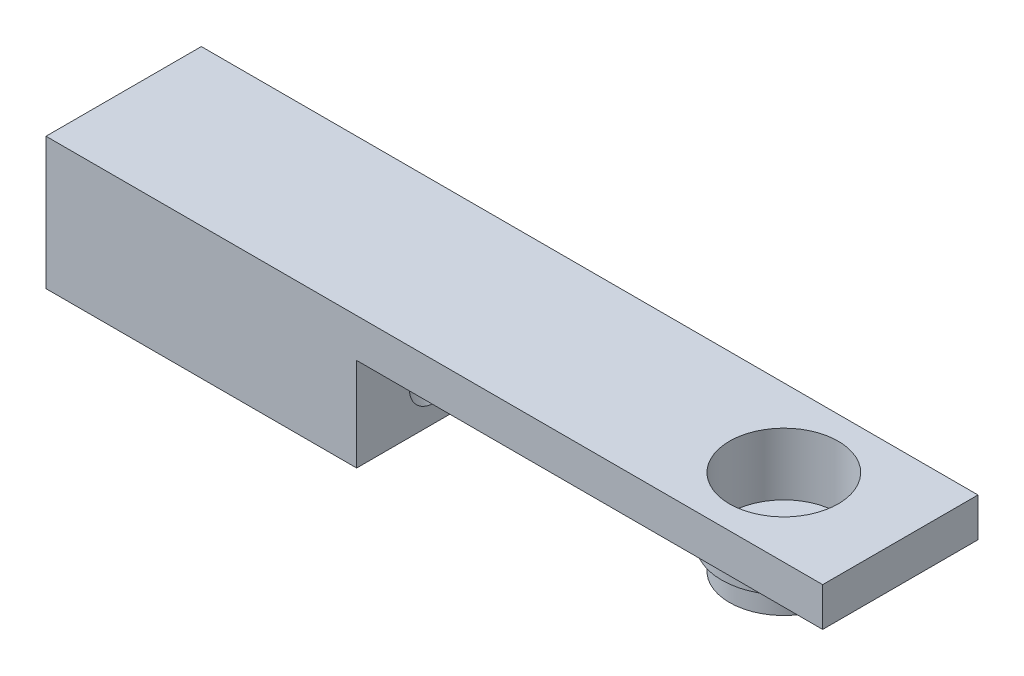
ISO-10303-21;
HEADER;
FILE_DESCRIPTION(('STEP AP214'),'2;1');
FILE_NAME('part.step','',(''),(''),'','','');
FILE_SCHEMA(('AUTOMOTIVE_DESIGN { 1 0 10303 214 1 1 1 1 }'));
ENDSEC;
DATA;
#1=APPLICATION_CONTEXT('core data for automotive mechanical design processes');
#2=APPLICATION_PROTOCOL_DEFINITION('international standard','automotive_design',2000,#1);
#3=PRODUCT_CONTEXT('',#1,'mechanical');
#4=PRODUCT('Part','Part','',(#3));
#5=PRODUCT_RELATED_PRODUCT_CATEGORY('part','',(#4));
#6=PRODUCT_DEFINITION_FORMATION('','',#4);
#7=PRODUCT_DEFINITION_CONTEXT('part definition',#1,'design');
#8=PRODUCT_DEFINITION('design','',#6,#7);
#9=PRODUCT_DEFINITION_SHAPE('','',#8);
#10=(LENGTH_UNIT() NAMED_UNIT(*) SI_UNIT(.MILLI.,.METRE.));
#11=(NAMED_UNIT(*) PLANE_ANGLE_UNIT() SI_UNIT($,.RADIAN.));
#12=(NAMED_UNIT(*) SI_UNIT($,.STERADIAN.) SOLID_ANGLE_UNIT());
#13=UNCERTAINTY_MEASURE_WITH_UNIT(LENGTH_MEASURE(1.E-05),#10,'distance_accuracy_value','');
#14=(GEOMETRIC_REPRESENTATION_CONTEXT(3) GLOBAL_UNCERTAINTY_ASSIGNED_CONTEXT((#13)) GLOBAL_UNIT_ASSIGNED_CONTEXT((#10,
#11,#12)) REPRESENTATION_CONTEXT('',''));
#15=CARTESIAN_POINT('',(0.,0.,0.));
#16=DIRECTION('',(0.,0.,1.));
#17=DIRECTION('',(1.,0.,0.));
#18=AXIS2_PLACEMENT_3D('',#15,#16,#17);
#19=CARTESIAN_POINT('',(40.,0.,0.));
#20=DIRECTION('',(-1.,0.,0.));
#21=DIRECTION('',(0.,0.,1.));
#22=AXIS2_PLACEMENT_3D('',#19,#20,#21);
#23=PLANE('',#22);
#24=CARTESIAN_POINT('',(40.,7.78411195304329,27.7910248890691));
#25=DIRECTION('',(1.,0.,0.));
#26=DIRECTION('',(0.,0.,-1.));
#27=AXIS2_PLACEMENT_3D('',#24,#25,#26);
#28=CIRCLE('',#27,3.15);
#29=CARTESIAN_POINT('',(40.,7.78411195304329,24.6410248890692));
#30=VERTEX_POINT('',#29);
#31=EDGE_CURVE('E53',#30,#30,#28,.T.);
#32=ORIENTED_EDGE('',*,*,#31,.F.);
#33=EDGE_LOOP('',(#32));
#34=FACE_BOUND('',#33,.T.);
#35=DIRECTION('',(0.,0.,-1.));
#36=VECTOR('',#35,1.);
#37=CARTESIAN_POINT('',(40.,14.3539879823419,37.724126619612));
#38=LINE('',#37,#36);
#39=CARTESIAN_POINT('',(40.,14.3539879823419,37.724126619612));
#40=VERTEX_POINT('',#39);
#41=CARTESIAN_POINT('',(40.,14.3539879823419,17.724126619612));
#42=VERTEX_POINT('',#41);
#43=EDGE_CURVE('E93',#40,#42,#38,.T.);
#44=ORIENTED_EDGE('',*,*,#43,.F.);
#45=DIRECTION('',(0.,-1.,0.));
#46=VECTOR('',#45,1.);
#47=CARTESIAN_POINT('',(40.,2.35398798234189,37.724126619612));
#48=LINE('',#47,#46);
#49=CARTESIAN_POINT('',(40.,2.35398798234189,37.724126619612));
#50=VERTEX_POINT('',#49);
#51=EDGE_CURVE('E95',#40,#50,#48,.T.);
#52=ORIENTED_EDGE('',*,*,#51,.T.);
#53=DIRECTION('',(0.,0.,-1.));
#54=VECTOR('',#53,1.);
#55=CARTESIAN_POINT('',(40.,2.35398798234189,37.724126619612));
#56=LINE('',#55,#54);
#57=CARTESIAN_POINT('',(40.,2.35398798234189,17.724126619612));
#58=VERTEX_POINT('',#57);
#59=EDGE_CURVE('E113',#50,#58,#56,.T.);
#60=ORIENTED_EDGE('',*,*,#59,.T.);
#61=DIRECTION('',(0.,1.,0.));
#62=VECTOR('',#61,1.);
#63=CARTESIAN_POINT('',(40.,2.35398798234189,17.724126619612));
#64=LINE('',#63,#62);
#65=EDGE_CURVE('E98',#58,#42,#64,.T.);
#66=ORIENTED_EDGE('',*,*,#65,.T.);
#67=EDGE_LOOP('',(#44,#52,#60,#66));
#68=FACE_BOUND('',#67,.T.);
#69=ADVANCED_FACE('F43',(#34,#68),#23,.F.);
#70=CARTESIAN_POINT('',(40.,2.35398798234189,37.724126619612));
#71=DIRECTION('',(0.,0.,-1.));
#72=DIRECTION('',(-1.,0.,0.));
#73=AXIS2_PLACEMENT_3D('',#70,#71,#72);
#74=PLANE('',#73);
#75=DIRECTION('',(0.,-1.,0.));
#76=VECTOR('',#75,1.);
#77=CARTESIAN_POINT('',(0.,2.35398798234189,37.724126619612));
#78=LINE('',#77,#76);
#79=CARTESIAN_POINT('',(0.,19.3539879823419,37.724126619612));
#80=VERTEX_POINT('',#79);
#81=CARTESIAN_POINT('',(0.,2.35398798234189,37.724126619612));
#82=VERTEX_POINT('',#81);
#83=EDGE_CURVE('E203',#80,#82,#78,.T.);
#84=ORIENTED_EDGE('',*,*,#83,.T.);
#85=DIRECTION('',(-1.,0.,0.));
#86=VECTOR('',#85,1.);
#87=CARTESIAN_POINT('',(40.,2.35398798234189,37.724126619612));
#88=LINE('',#87,#86);
#89=EDGE_CURVE('E112',#50,#82,#88,.T.);
#90=ORIENTED_EDGE('',*,*,#89,.F.);
#91=ORIENTED_EDGE('',*,*,#51,.F.);
#92=DIRECTION('',(-1.,0.,0.));
#93=VECTOR('',#92,1.);
#94=CARTESIAN_POINT('',(100.,14.3539879823419,37.724126619612));
#95=LINE('',#94,#93);
#96=CARTESIAN_POINT('',(100.,14.3539879823419,37.724126619612));
#97=VERTEX_POINT('',#96);
#98=EDGE_CURVE('E102',#97,#40,#95,.T.);
#99=ORIENTED_EDGE('',*,*,#98,.F.);
#100=DIRECTION('',(0.,-1.,0.));
#101=VECTOR('',#100,1.);
#102=CARTESIAN_POINT('',(100.,19.3539879823419,37.724126619612));
#103=LINE('',#102,#101);
#104=CARTESIAN_POINT('',(100.,19.3539879823419,37.724126619612));
#105=VERTEX_POINT('',#104);
#106=EDGE_CURVE('E116',#105,#97,#103,.T.);
#107=ORIENTED_EDGE('',*,*,#106,.F.);
#108=DIRECTION('',(-1.,0.,0.));
#109=VECTOR('',#108,1.);
#110=CARTESIAN_POINT('',(40.,19.3539879823419,37.724126619612));
#111=LINE('',#110,#109);
#112=EDGE_CURVE('E198',#105,#80,#111,.T.);
#113=ORIENTED_EDGE('',*,*,#112,.T.);
#114=EDGE_LOOP('',(#84,#90,#91,#99,#107,#113));
#115=FACE_BOUND('',#114,.T.);
#116=ADVANCED_FACE('F109',(#115),#74,.F.);
#117=CARTESIAN_POINT('',(40.,2.35398798234189,37.724126619612));
#118=DIRECTION('',(0.,1.,0.));
#119=DIRECTION('',(0.,0.,1.));
#120=AXIS2_PLACEMENT_3D('',#117,#118,#119);
#121=PLANE('',#120);
#122=DIRECTION('',(0.,0.,-1.));
#123=VECTOR('',#122,1.);
#124=CARTESIAN_POINT('',(0.,2.35398798234189,37.724126619612));
#125=LINE('',#124,#123);
#126=CARTESIAN_POINT('',(0.,2.35398798234189,17.724126619612));
#127=VERTEX_POINT('',#126);
#128=EDGE_CURVE('E204',#82,#127,#125,.T.);
#129=ORIENTED_EDGE('',*,*,#128,.T.);
#130=DIRECTION('',(-1.,0.,0.));
#131=VECTOR('',#130,1.);
#132=CARTESIAN_POINT('',(40.,2.35398798234189,17.724126619612));
#133=LINE('',#132,#131);
#134=EDGE_CURVE('E122',#58,#127,#133,.T.);
#135=ORIENTED_EDGE('',*,*,#134,.F.);
#136=ORIENTED_EDGE('',*,*,#59,.F.);
#137=ORIENTED_EDGE('',*,*,#89,.T.);
#138=EDGE_LOOP('',(#129,#135,#136,#137));
#139=FACE_BOUND('',#138,.T.);
#140=ADVANCED_FACE('F151',(#139),#121,.F.);
#141=CARTESIAN_POINT('',(40.,2.35398798234189,17.724126619612));
#142=DIRECTION('',(0.,0.,1.));
#143=DIRECTION('',(1.,0.,0.));
#144=AXIS2_PLACEMENT_3D('',#141,#142,#143);
#145=PLANE('',#144);
#146=DIRECTION('',(0.,1.,0.));
#147=VECTOR('',#146,1.);
#148=CARTESIAN_POINT('',(0.,2.35398798234189,17.724126619612));
#149=LINE('',#148,#147);
#150=CARTESIAN_POINT('',(0.,19.3539879823419,17.724126619612));
#151=VERTEX_POINT('',#150);
#152=EDGE_CURVE('E123',#127,#151,#149,.T.);
#153=ORIENTED_EDGE('',*,*,#152,.T.);
#154=DIRECTION('',(-1.,0.,0.));
#155=VECTOR('',#154,1.);
#156=CARTESIAN_POINT('',(40.,19.3539879823419,17.724126619612));
#157=LINE('',#156,#155);
#158=CARTESIAN_POINT('',(100.,19.3539879823419,17.724126619612));
#159=VERTEX_POINT('',#158);
#160=EDGE_CURVE('E138',#159,#151,#157,.T.);
#161=ORIENTED_EDGE('',*,*,#160,.F.);
#162=DIRECTION('',(0.,1.,0.));
#163=VECTOR('',#162,1.);
#164=CARTESIAN_POINT('',(100.,19.3539879823419,17.724126619612));
#165=LINE('',#164,#163);
#166=CARTESIAN_POINT('',(100.,14.3539879823419,17.724126619612));
#167=VERTEX_POINT('',#166);
#168=EDGE_CURVE('E129',#167,#159,#165,.T.);
#169=ORIENTED_EDGE('',*,*,#168,.F.);
#170=DIRECTION('',(-1.,0.,0.));
#171=VECTOR('',#170,1.);
#172=CARTESIAN_POINT('',(100.,14.3539879823419,17.724126619612));
#173=LINE('',#172,#171);
#174=EDGE_CURVE('E121',#167,#42,#173,.T.);
#175=ORIENTED_EDGE('',*,*,#174,.T.);
#176=ORIENTED_EDGE('',*,*,#65,.F.);
#177=ORIENTED_EDGE('',*,*,#134,.T.);
#178=EDGE_LOOP('',(#153,#161,#169,#175,#176,#177));
#179=FACE_BOUND('',#178,.T.);
#180=ADVANCED_FACE('F192',(#179),#145,.F.);
#181=CARTESIAN_POINT('',(40.,19.3539879823419,37.724126619612));
#182=DIRECTION('',(0.,-1.,0.));
#183=DIRECTION('',(0.,0.,-1.));
#184=AXIS2_PLACEMENT_3D('',#181,#182,#183);
#185=PLANE('',#184);
#186=CARTESIAN_POINT('',(85.,19.3539879823419,27.724126619612));
#187=DIRECTION('',(0.,1.,0.));
#188=DIRECTION('',(0.,0.,1.));
#189=AXIS2_PLACEMENT_3D('',#186,#187,#188);
#190=CIRCLE('',#189,7.);
#191=CARTESIAN_POINT('',(85.,19.3539879823419,34.724126619612));
#192=VERTEX_POINT('',#191);
#193=EDGE_CURVE('E12',#192,#192,#190,.T.);
#194=ORIENTED_EDGE('',*,*,#193,.F.);
#195=EDGE_LOOP('',(#194));
#196=FACE_BOUND('',#195,.T.);
#197=DIRECTION('',(0.,0.,1.));
#198=VECTOR('',#197,1.);
#199=CARTESIAN_POINT('',(0.,19.3539879823419,37.724126619612));
#200=LINE('',#199,#198);
#201=EDGE_CURVE('E195',#151,#80,#200,.T.);
#202=ORIENTED_EDGE('',*,*,#201,.T.);
#203=ORIENTED_EDGE('',*,*,#112,.F.);
#204=DIRECTION('',(0.,0.,1.));
#205=VECTOR('',#204,1.);
#206=CARTESIAN_POINT('',(100.,19.3539879823419,37.724126619612));
#207=LINE('',#206,#205);
#208=EDGE_CURVE('E125',#159,#105,#207,.T.);
#209=ORIENTED_EDGE('',*,*,#208,.F.);
#210=ORIENTED_EDGE('',*,*,#160,.T.);
#211=EDGE_LOOP('',(#202,#203,#209,#210));
#212=FACE_BOUND('',#211,.T.);
#213=ADVANCED_FACE('F189',(#196,#212),#185,.F.);
#214=CARTESIAN_POINT('',(0.,0.,0.));
#215=DIRECTION('',(-1.,0.,0.));
#216=DIRECTION('',(0.,0.,1.));
#217=AXIS2_PLACEMENT_3D('',#214,#215,#216);
#218=PLANE('',#217);
#219=CARTESIAN_POINT('',(0.,7.78411195304329,27.7910248890691));
#220=DIRECTION('',(1.,0.,0.));
#221=DIRECTION('',(0.,0.,-1.));
#222=AXIS2_PLACEMENT_3D('',#219,#220,#221);
#223=CIRCLE('',#222,1.69999999999998);
#224=CARTESIAN_POINT('',(0.,7.78411195304329,26.0910248890692));
#225=VERTEX_POINT('',#224);
#226=EDGE_CURVE('E103',#225,#225,#223,.T.);
#227=ORIENTED_EDGE('',*,*,#226,.T.);
#228=EDGE_LOOP('',(#227));
#229=FACE_BOUND('',#228,.T.);
#230=ORIENTED_EDGE('',*,*,#83,.F.);
#231=ORIENTED_EDGE('',*,*,#201,.F.);
#232=ORIENTED_EDGE('',*,*,#152,.F.);
#233=ORIENTED_EDGE('',*,*,#128,.F.);
#234=EDGE_LOOP('',(#230,#231,#232,#233));
#235=FACE_BOUND('',#234,.T.);
#236=ADVANCED_FACE('F155',(#229,#235),#218,.T.);
#237=CARTESIAN_POINT('',(100.,14.3539879823419,37.724126619612));
#238=DIRECTION('',(0.,1.,0.));
#239=DIRECTION('',(0.,0.,1.));
#240=AXIS2_PLACEMENT_3D('',#237,#238,#239);
#241=PLANE('',#240);
#242=CARTESIAN_POINT('',(85.,14.3539879823419,27.724126619612));
#243=DIRECTION('',(0.,1.,0.));
#244=DIRECTION('',(0.,0.,1.));
#245=AXIS2_PLACEMENT_3D('',#242,#243,#244);
#246=CIRCLE('',#245,8.);
#247=CARTESIAN_POINT('',(85.,14.3539879823419,35.724126619612));
#248=VERTEX_POINT('',#247);
#249=EDGE_CURVE('E128',#248,#248,#246,.F.);
#250=ORIENTED_EDGE('',*,*,#249,.F.);
#251=EDGE_LOOP('',(#250));
#252=FACE_BOUND('',#251,.T.);
#253=ORIENTED_EDGE('',*,*,#43,.T.);
#254=ORIENTED_EDGE('',*,*,#174,.F.);
#255=DIRECTION('',(0.,0.,-1.));
#256=VECTOR('',#255,1.);
#257=CARTESIAN_POINT('',(100.,14.3539879823419,37.724126619612));
#258=LINE('',#257,#256);
#259=EDGE_CURVE('E59',#97,#167,#258,.T.);
#260=ORIENTED_EDGE('',*,*,#259,.F.);
#261=ORIENTED_EDGE('',*,*,#98,.T.);
#262=EDGE_LOOP('',(#253,#254,#260,#261));
#263=FACE_BOUND('',#262,.T.);
#264=ADVANCED_FACE('F115',(#252,#263),#241,.F.);
#265=CARTESIAN_POINT('',(100.,0.,0.));
#266=DIRECTION('',(1.,0.,0.));
#267=DIRECTION('',(0.,0.,-1.));
#268=AXIS2_PLACEMENT_3D('',#265,#266,#267);
#269=PLANE('',#268);
#270=ORIENTED_EDGE('',*,*,#106,.T.);
#271=ORIENTED_EDGE('',*,*,#259,.T.);
#272=ORIENTED_EDGE('',*,*,#168,.T.);
#273=ORIENTED_EDGE('',*,*,#208,.T.);
#274=EDGE_LOOP('',(#270,#271,#272,#273));
#275=FACE_BOUND('',#274,.T.);
#276=ADVANCED_FACE('F159',(#275),#269,.T.);
#277=CARTESIAN_POINT('',(85.,11.3539879823419,27.724126619612));
#278=DIRECTION('',(0.,1.,0.));
#279=DIRECTION('',(0.,0.,1.));
#280=AXIS2_PLACEMENT_3D('',#277,#278,#279);
#281=CYLINDRICAL_SURFACE('',#280,8.);
#282=CARTESIAN_POINT('',(85.,11.3539879823419,27.724126619612));
#283=DIRECTION('',(0.,-1.,0.));
#284=DIRECTION('',(0.,0.,-1.));
#285=AXIS2_PLACEMENT_3D('',#282,#283,#284);
#286=CIRCLE('',#285,8.);
#287=CARTESIAN_POINT('',(85.,11.3539879823419,19.724126619612));
#288=VERTEX_POINT('',#287);
#289=EDGE_CURVE('E132',#288,#288,#286,.T.);
#290=ORIENTED_EDGE('',*,*,#289,.F.);
#291=EDGE_LOOP('',(#290));
#292=FACE_BOUND('',#291,.T.);
#293=ORIENTED_EDGE('',*,*,#249,.T.);
#294=EDGE_LOOP('',(#293));
#295=FACE_BOUND('',#294,.T.);
#296=ADVANCED_FACE('F163',(#292,#295),#281,.T.);
#297=CARTESIAN_POINT('',(85.,11.3539879823419,27.724126619612));
#298=DIRECTION('',(0.,-1.,0.));
#299=DIRECTION('',(0.,0.,-1.));
#300=AXIS2_PLACEMENT_3D('',#297,#298,#299);
#301=PLANE('',#300);
#302=CARTESIAN_POINT('',(85.,11.3539879823419,27.724126619612));
#303=DIRECTION('',(0.,1.,0.));
#304=DIRECTION('',(0.,0.,1.));
#305=AXIS2_PLACEMENT_3D('',#302,#303,#304);
#306=CIRCLE('',#305,7.);
#307=CARTESIAN_POINT('',(85.,11.3539879823419,34.724126619612));
#308=VERTEX_POINT('',#307);
#309=EDGE_CURVE('E47',#308,#308,#306,.T.);
#310=ORIENTED_EDGE('',*,*,#309,.T.);
#311=EDGE_LOOP('',(#310));
#312=FACE_BOUND('',#311,.T.);
#313=ORIENTED_EDGE('',*,*,#289,.T.);
#314=EDGE_LOOP('',(#313));
#315=FACE_BOUND('',#314,.T.);
#316=ADVANCED_FACE('F166',(#312,#315),#301,.T.);
#317=CARTESIAN_POINT('',(40.,7.78411195304329,27.7910248890691));
#318=DIRECTION('',(1.,0.,0.));
#319=DIRECTION('',(0.,0.,-1.));
#320=AXIS2_PLACEMENT_3D('',#317,#318,#319);
#321=CYLINDRICAL_SURFACE('',#320,1.69999999999999);
#322=ORIENTED_EDGE('',*,*,#226,.F.);
#323=EDGE_LOOP('',(#322));
#324=FACE_BOUND('',#323,.T.);
#325=CARTESIAN_POINT('',(38.55,7.78411195304329,27.7910248890691));
#326=DIRECTION('',(1.,0.,0.));
#327=DIRECTION('',(0.,0.,-1.));
#328=AXIS2_PLACEMENT_3D('',#325,#326,#327);
#329=CIRCLE('',#328,1.69999999999999);
#330=CARTESIAN_POINT('',(38.55,7.78411195304329,26.0910248890692));
#331=VERTEX_POINT('',#330);
#332=EDGE_CURVE('E135',#331,#331,#329,.T.);
#333=ORIENTED_EDGE('',*,*,#332,.T.);
#334=EDGE_LOOP('',(#333));
#335=FACE_BOUND('',#334,.T.);
#336=ADVANCED_FACE('F170',(#324,#335),#321,.F.);
#337=CARTESIAN_POINT('',(40.,7.78411195304329,27.7910248890691));
#338=DIRECTION('',(1.,0.,0.));
#339=DIRECTION('',(0.,0.,-1.));
#340=AXIS2_PLACEMENT_3D('',#337,#338,#339);
#341=CONICAL_SURFACE('',#340,3.15,0.78539816339745);
#342=ORIENTED_EDGE('',*,*,#332,.F.);
#343=EDGE_LOOP('',(#342));
#344=FACE_BOUND('',#343,.T.);
#345=ORIENTED_EDGE('',*,*,#31,.T.);
#346=EDGE_LOOP('',(#345));
#347=FACE_BOUND('',#346,.T.);
#348=ADVANCED_FACE('F144',(#344,#347),#341,.F.);
#349=CARTESIAN_POINT('',(85.,11.3539879823419,27.724126619612));
#350=DIRECTION('',(0.,1.,0.));
#351=DIRECTION('',(0.,0.,1.));
#352=AXIS2_PLACEMENT_3D('',#349,#350,#351);
#353=CYLINDRICAL_SURFACE('',#352,7.);
#354=ORIENTED_EDGE('',*,*,#309,.F.);
#355=EDGE_LOOP('',(#354));
#356=FACE_BOUND('',#355,.T.);
#357=ORIENTED_EDGE('',*,*,#193,.T.);
#358=EDGE_LOOP('',(#357));
#359=FACE_BOUND('',#358,.T.);
#360=ADVANCED_FACE('F45',(#356,#359),#353,.F.);
#361=CLOSED_SHELL('',(#69,#116,#140,#180,#213,#236,#264,#276,#296,#316,#336,#348,#360));
#362=MANIFOLD_SOLID_BREP('B2',#361);
#363=CARTESIAN_POINT('',(85.,8.35398798234189,27.724126619612));
#364=DIRECTION('',(0.,-1.,0.));
#365=DIRECTION('',(0.,0.,-1.));
#366=AXIS2_PLACEMENT_3D('',#363,#364,#365);
#367=PLANE('',#366);
#368=CARTESIAN_POINT('',(85.,8.35398798234189,27.724126619612));
#369=DIRECTION('',(0.,-1.,0.));
#370=DIRECTION('',(0.,0.,-1.));
#371=AXIS2_PLACEMENT_3D('',#368,#369,#370);
#372=CIRCLE('',#371,7.);
#373=CARTESIAN_POINT('',(85.,8.35398798234189,20.724126619612));
#374=VERTEX_POINT('',#373);
#375=EDGE_CURVE('E42',#374,#374,#372,.T.);
#376=ORIENTED_EDGE('',*,*,#375,.T.);
#377=EDGE_LOOP('',(#376));
#378=FACE_BOUND('',#377,.T.);
#379=ADVANCED_FACE('F315',(#378),#367,.T.);
#380=CARTESIAN_POINT('',(85.,8.35398798234189,27.724126619612));
#381=DIRECTION('',(0.,1.,0.));
#382=DIRECTION('',(0.,0.,1.));
#383=AXIS2_PLACEMENT_3D('',#380,#381,#382);
#384=CYLINDRICAL_SURFACE('',#383,7.);
#385=ORIENTED_EDGE('',*,*,#375,.F.);
#386=EDGE_LOOP('',(#385));
#387=FACE_BOUND('',#386,.T.);
#388=CARTESIAN_POINT('',(85.,11.3539879823419,27.724126619612));
#389=DIRECTION('',(0.,1.,0.));
#390=DIRECTION('',(0.,0.,1.));
#391=AXIS2_PLACEMENT_3D('',#388,#389,#390);
#392=CIRCLE('',#391,7.);
#393=CARTESIAN_POINT('',(85.,11.3539879823419,34.724126619612));
#394=VERTEX_POINT('',#393);
#395=EDGE_CURVE('E322',#394,#394,#392,.T.);
#396=ORIENTED_EDGE('',*,*,#395,.F.);
#397=EDGE_LOOP('',(#396));
#398=FACE_BOUND('',#397,.T.);
#399=ADVANCED_FACE('F317',(#387,#398),#384,.T.);
#400=CARTESIAN_POINT('',(85.,11.3539879823419,27.724126619612));
#401=DIRECTION('',(0.,1.,0.));
#402=DIRECTION('',(0.,0.,1.));
#403=AXIS2_PLACEMENT_3D('',#400,#401,#402);
#404=PLANE('',#403);
#405=ORIENTED_EDGE('',*,*,#395,.T.);
#406=EDGE_LOOP('',(#405));
#407=FACE_BOUND('',#406,.T.);
#408=ADVANCED_FACE('F328',(#407),#404,.T.);
#409=CLOSED_SHELL('',(#379,#399,#408));
#410=MANIFOLD_SOLID_BREP('B6',#409);
#411=ADVANCED_BREP_SHAPE_REPRESENTATION('',(#18,#362,#410),#14);
#412=SHAPE_DEFINITION_REPRESENTATION(#9,#411);
ENDSEC;
END-ISO-10303-21;
